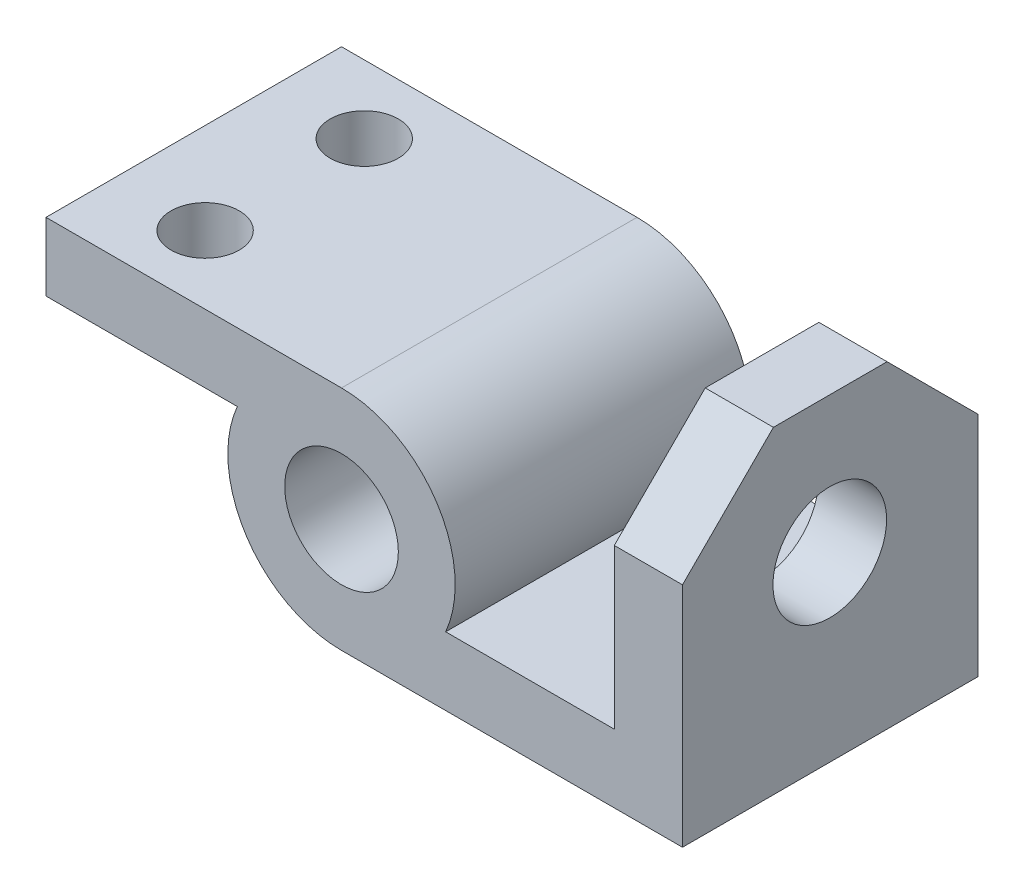
ISO-10303-21;
HEADER;
FILE_DESCRIPTION(('STEP AP214'),'2;1');
FILE_NAME('part.step','',(''),(''),'','','');
FILE_SCHEMA(('AUTOMOTIVE_DESIGN { 1 0 10303 214 1 1 1 1 }'));
ENDSEC;
DATA;
#1=APPLICATION_CONTEXT('core data for automotive mechanical design processes');
#2=APPLICATION_PROTOCOL_DEFINITION('international standard','automotive_design',2000,#1);
#3=PRODUCT_CONTEXT('',#1,'mechanical');
#4=PRODUCT('Part','Part','',(#3));
#5=PRODUCT_RELATED_PRODUCT_CATEGORY('part','',(#4));
#6=PRODUCT_DEFINITION_FORMATION('','',#4);
#7=PRODUCT_DEFINITION_CONTEXT('part definition',#1,'design');
#8=PRODUCT_DEFINITION('design','',#6,#7);
#9=PRODUCT_DEFINITION_SHAPE('','',#8);
#10=(LENGTH_UNIT() NAMED_UNIT(*) SI_UNIT(.MILLI.,.METRE.));
#11=(NAMED_UNIT(*) PLANE_ANGLE_UNIT() SI_UNIT($,.RADIAN.));
#12=(NAMED_UNIT(*) SI_UNIT($,.STERADIAN.) SOLID_ANGLE_UNIT());
#13=UNCERTAINTY_MEASURE_WITH_UNIT(LENGTH_MEASURE(1.E-05),#10,'distance_accuracy_value','');
#14=(GEOMETRIC_REPRESENTATION_CONTEXT(3) GLOBAL_UNCERTAINTY_ASSIGNED_CONTEXT((#13)) GLOBAL_UNIT_ASSIGNED_CONTEXT((#10,
#11,#12)) REPRESENTATION_CONTEXT('',''));
#15=CARTESIAN_POINT('',(0.,0.,0.));
#16=DIRECTION('',(0.,0.,1.));
#17=DIRECTION('',(1.,0.,0.));
#18=AXIS2_PLACEMENT_3D('',#15,#16,#17);
#19=CARTESIAN_POINT('',(0.,0.,3250.));
#20=DIRECTION('',(0.,0.,-1.));
#21=DIRECTION('',(-1.,0.,0.));
#22=AXIS2_PLACEMENT_3D('',#19,#20,#21);
#23=CYLINDRICAL_SURFACE('',#22,1250.);
#24=CARTESIAN_POINT('',(0.,0.,0.));
#25=DIRECTION('',(0.,0.,1.));
#26=DIRECTION('',(1.,0.,0.));
#27=AXIS2_PLACEMENT_3D('',#24,#25,#26);
#28=CIRCLE('',#27,1250.);
#29=CARTESIAN_POINT('',(1145.64392373896,-500.,0.));
#30=VERTEX_POINT('',#29);
#31=CARTESIAN_POINT('',(0.,1250.,0.));
#32=VERTEX_POINT('',#31);
#33=EDGE_CURVE('E164',#30,#32,#28,.T.);
#34=ORIENTED_EDGE('',*,*,#33,.T.);
#35=DIRECTION('',(0.,0.,-1.));
#36=VECTOR('',#35,1.);
#37=CARTESIAN_POINT('',(0.,1250.,3250.));
#38=LINE('',#37,#36);
#39=CARTESIAN_POINT('',(0.,1250.,3250.));
#40=VERTEX_POINT('',#39);
#41=EDGE_CURVE('E142',#40,#32,#38,.T.);
#42=ORIENTED_EDGE('',*,*,#41,.F.);
#43=CARTESIAN_POINT('',(0.,0.,3250.));
#44=DIRECTION('',(0.,0.,1.));
#45=DIRECTION('',(1.,0.,0.));
#46=AXIS2_PLACEMENT_3D('',#43,#44,#45);
#47=CIRCLE('',#46,1250.);
#48=CARTESIAN_POINT('',(1145.64392373896,-500.,3250.));
#49=VERTEX_POINT('',#48);
#50=EDGE_CURVE('E150',#49,#40,#47,.T.);
#51=ORIENTED_EDGE('',*,*,#50,.F.);
#52=DIRECTION('',(0.,0.,-1.));
#53=VECTOR('',#52,1.);
#54=CARTESIAN_POINT('',(1145.64392373896,-500.,3250.));
#55=LINE('',#54,#53);
#56=EDGE_CURVE('E225',#49,#30,#55,.T.);
#57=ORIENTED_EDGE('',*,*,#56,.T.);
#58=EDGE_LOOP('',(#34,#42,#51,#57));
#59=FACE_BOUND('',#58,.T.);
#60=ADVANCED_FACE('F46',(#59),#23,.T.);
#61=CARTESIAN_POINT('',(0.,1250.,3250.));
#62=DIRECTION('',(0.,-1.,0.));
#63=DIRECTION('',(1.,0.,0.));
#64=AXIS2_PLACEMENT_3D('',#61,#62,#63);
#65=PLANE('',#64);
#66=CARTESIAN_POINT('',(-2249.99999999998,1250.,2500.));
#67=DIRECTION('',(0.,1.,0.));
#68=DIRECTION('',(-1.,0.,0.));
#69=AXIS2_PLACEMENT_3D('',#66,#67,#68);
#70=CIRCLE('',#69,375.);
#71=CARTESIAN_POINT('',(-2624.99999999998,1250.,2500.));
#72=VERTEX_POINT('',#71);
#73=EDGE_CURVE('E370',#72,#72,#70,.T.);
#74=ORIENTED_EDGE('',*,*,#73,.F.);
#75=EDGE_LOOP('',(#74));
#76=FACE_BOUND('',#75,.T.);
#77=CARTESIAN_POINT('',(-2250.,1250.,750.));
#78=DIRECTION('',(0.,1.,0.));
#79=DIRECTION('',(-1.,0.,0.));
#80=AXIS2_PLACEMENT_3D('',#77,#78,#79);
#81=CIRCLE('',#80,375.);
#82=CARTESIAN_POINT('',(-2625.,1250.,750.));
#83=VERTEX_POINT('',#82);
#84=EDGE_CURVE('E366',#83,#83,#81,.T.);
#85=ORIENTED_EDGE('',*,*,#84,.F.);
#86=EDGE_LOOP('',(#85));
#87=FACE_BOUND('',#86,.T.);
#88=DIRECTION('',(-1.,0.,0.));
#89=VECTOR('',#88,1.);
#90=CARTESIAN_POINT('',(0.,1250.,0.));
#91=LINE('',#90,#89);
#92=CARTESIAN_POINT('',(-3250.,1250.,0.));
#93=VERTEX_POINT('',#92);
#94=EDGE_CURVE('E261',#32,#93,#91,.T.);
#95=ORIENTED_EDGE('',*,*,#94,.T.);
#96=DIRECTION('',(0.,0.,-1.));
#97=VECTOR('',#96,1.);
#98=CARTESIAN_POINT('',(-3250.,1250.,3250.));
#99=LINE('',#98,#97);
#100=CARTESIAN_POINT('',(-3250.,1250.,3250.));
#101=VERTEX_POINT('',#100);
#102=EDGE_CURVE('E145',#101,#93,#99,.T.);
#103=ORIENTED_EDGE('',*,*,#102,.F.);
#104=DIRECTION('',(-1.,0.,0.));
#105=VECTOR('',#104,1.);
#106=CARTESIAN_POINT('',(0.,1250.,3250.));
#107=LINE('',#106,#105);
#108=EDGE_CURVE('E138',#40,#101,#107,.T.);
#109=ORIENTED_EDGE('',*,*,#108,.F.);
#110=ORIENTED_EDGE('',*,*,#41,.T.);
#111=EDGE_LOOP('',(#95,#103,#109,#110));
#112=FACE_BOUND('',#111,.T.);
#113=ADVANCED_FACE('F140',(#76,#87,#112),#65,.F.);
#114=CARTESIAN_POINT('',(-3250.,1250.,3250.));
#115=DIRECTION('',(1.,0.,0.));
#116=DIRECTION('',(0.,0.,-1.));
#117=AXIS2_PLACEMENT_3D('',#114,#115,#116);
#118=PLANE('',#117);
#119=DIRECTION('',(0.,-1.,0.));
#120=VECTOR('',#119,1.);
#121=CARTESIAN_POINT('',(-3250.,1250.,0.));
#122=LINE('',#121,#120);
#123=CARTESIAN_POINT('',(-3250.,500.,0.));
#124=VERTEX_POINT('',#123);
#125=EDGE_CURVE('E252',#93,#124,#122,.T.);
#126=ORIENTED_EDGE('',*,*,#125,.T.);
#127=DIRECTION('',(0.,0.,-1.));
#128=VECTOR('',#127,1.);
#129=CARTESIAN_POINT('',(-3250.,500.,3250.));
#130=LINE('',#129,#128);
#131=CARTESIAN_POINT('',(-3250.,500.,3250.));
#132=VERTEX_POINT('',#131);
#133=EDGE_CURVE('E173',#132,#124,#130,.T.);
#134=ORIENTED_EDGE('',*,*,#133,.F.);
#135=DIRECTION('',(0.,-1.,0.));
#136=VECTOR('',#135,1.);
#137=CARTESIAN_POINT('',(-3250.,1250.,3250.));
#138=LINE('',#137,#136);
#139=EDGE_CURVE('E149',#101,#132,#138,.T.);
#140=ORIENTED_EDGE('',*,*,#139,.F.);
#141=ORIENTED_EDGE('',*,*,#102,.T.);
#142=EDGE_LOOP('',(#126,#134,#140,#141));
#143=FACE_BOUND('',#142,.T.);
#144=ADVANCED_FACE('F283',(#143),#118,.F.);
#145=CARTESIAN_POINT('',(-3250.,500.,3250.));
#146=DIRECTION('',(0.,1.,0.));
#147=DIRECTION('',(0.,0.,1.));
#148=AXIS2_PLACEMENT_3D('',#145,#146,#147);
#149=PLANE('',#148);
#150=CARTESIAN_POINT('',(-2249.99999999998,500.,2500.));
#151=DIRECTION('',(0.,1.,0.));
#152=DIRECTION('',(0.,0.,1.));
#153=AXIS2_PLACEMENT_3D('',#150,#151,#152);
#154=CIRCLE('',#153,375.);
#155=CARTESIAN_POINT('',(-2249.99999999998,500.,2875.));
#156=VERTEX_POINT('',#155);
#157=EDGE_CURVE('E363',#156,#156,#154,.F.);
#158=ORIENTED_EDGE('',*,*,#157,.F.);
#159=EDGE_LOOP('',(#158));
#160=FACE_BOUND('',#159,.T.);
#161=CARTESIAN_POINT('',(-2250.,500.,750.));
#162=DIRECTION('',(0.,1.,0.));
#163=DIRECTION('',(0.,0.,1.));
#164=AXIS2_PLACEMENT_3D('',#161,#162,#163);
#165=CIRCLE('',#164,375.);
#166=CARTESIAN_POINT('',(-2250.,500.,1125.));
#167=VERTEX_POINT('',#166);
#168=EDGE_CURVE('E371',#167,#167,#165,.F.);
#169=ORIENTED_EDGE('',*,*,#168,.F.);
#170=EDGE_LOOP('',(#169));
#171=FACE_BOUND('',#170,.T.);
#172=DIRECTION('',(1.,0.,0.));
#173=VECTOR('',#172,1.);
#174=CARTESIAN_POINT('',(-3250.,500.,0.));
#175=LINE('',#174,#173);
#176=CARTESIAN_POINT('',(-1145.64392373896,500.,0.));
#177=VERTEX_POINT('',#176);
#178=EDGE_CURVE('E246',#124,#177,#175,.T.);
#179=ORIENTED_EDGE('',*,*,#178,.T.);
#180=DIRECTION('',(0.,0.,-1.));
#181=VECTOR('',#180,1.);
#182=CARTESIAN_POINT('',(-1145.64392373896,500.,3250.));
#183=LINE('',#182,#181);
#184=CARTESIAN_POINT('',(-1145.64392373896,500.,3250.));
#185=VERTEX_POINT('',#184);
#186=EDGE_CURVE('E235',#185,#177,#183,.T.);
#187=ORIENTED_EDGE('',*,*,#186,.F.);
#188=DIRECTION('',(1.,0.,0.));
#189=VECTOR('',#188,1.);
#190=CARTESIAN_POINT('',(-3250.,500.,3250.));
#191=LINE('',#190,#189);
#192=EDGE_CURVE('E247',#132,#185,#191,.T.);
#193=ORIENTED_EDGE('',*,*,#192,.F.);
#194=ORIENTED_EDGE('',*,*,#133,.T.);
#195=EDGE_LOOP('',(#179,#187,#193,#194));
#196=FACE_BOUND('',#195,.T.);
#197=ADVANCED_FACE('F244',(#160,#171,#196),#149,.F.);
#198=CARTESIAN_POINT('',(0.,0.,3250.));
#199=DIRECTION('',(0.,0.,-1.));
#200=DIRECTION('',(-1.,0.,0.));
#201=AXIS2_PLACEMENT_3D('',#198,#199,#200);
#202=CYLINDRICAL_SURFACE('',#201,1250.);
#203=CARTESIAN_POINT('',(0.,0.,0.));
#204=DIRECTION('',(0.,0.,1.));
#205=DIRECTION('',(1.,0.,0.));
#206=AXIS2_PLACEMENT_3D('',#203,#204,#205);
#207=CIRCLE('',#206,1250.);
#208=CARTESIAN_POINT('',(-2.29621274840129E-13,-1250.,0.));
#209=VERTEX_POINT('',#208);
#210=EDGE_CURVE('E254',#177,#209,#207,.T.);
#211=ORIENTED_EDGE('',*,*,#210,.T.);
#212=DIRECTION('',(0.,0.,-1.));
#213=VECTOR('',#212,1.);
#214=CARTESIAN_POINT('',(-2.29621274840129E-13,-1250.,3250.));
#215=LINE('',#214,#213);
#216=CARTESIAN_POINT('',(-2.29621274840129E-13,-1250.,3250.));
#217=VERTEX_POINT('',#216);
#218=EDGE_CURVE('E231',#217,#209,#215,.T.);
#219=ORIENTED_EDGE('',*,*,#218,.F.);
#220=CARTESIAN_POINT('',(0.,0.,3250.));
#221=DIRECTION('',(0.,0.,1.));
#222=DIRECTION('',(1.,0.,0.));
#223=AXIS2_PLACEMENT_3D('',#220,#221,#222);
#224=CIRCLE('',#223,1250.);
#225=EDGE_CURVE('E287',#185,#217,#224,.T.);
#226=ORIENTED_EDGE('',*,*,#225,.F.);
#227=ORIENTED_EDGE('',*,*,#186,.T.);
#228=EDGE_LOOP('',(#211,#219,#226,#227));
#229=FACE_BOUND('',#228,.T.);
#230=ADVANCED_FACE('F296',(#229),#202,.T.);
#231=CARTESIAN_POINT('',(0.,-1250.,3250.));
#232=DIRECTION('',(0.,1.,0.));
#233=DIRECTION('',(0.,0.,1.));
#234=AXIS2_PLACEMENT_3D('',#231,#232,#233);
#235=PLANE('',#234);
#236=DIRECTION('',(1.,0.,0.));
#237=VECTOR('',#236,1.);
#238=CARTESIAN_POINT('',(0.,-1250.,0.));
#239=LINE('',#238,#237);
#240=CARTESIAN_POINT('',(3750.,-1250.,0.));
#241=VERTEX_POINT('',#240);
#242=EDGE_CURVE('E259',#209,#241,#239,.T.);
#243=ORIENTED_EDGE('',*,*,#242,.T.);
#244=DIRECTION('',(0.,0.,-1.));
#245=VECTOR('',#244,1.);
#246=CARTESIAN_POINT('',(3750.,-1250.,3250.));
#247=LINE('',#246,#245);
#248=CARTESIAN_POINT('',(3750.,-1250.,3250.));
#249=VERTEX_POINT('',#248);
#250=EDGE_CURVE('E222',#249,#241,#247,.T.);
#251=ORIENTED_EDGE('',*,*,#250,.F.);
#252=DIRECTION('',(1.,0.,0.));
#253=VECTOR('',#252,1.);
#254=CARTESIAN_POINT('',(0.,-1250.,3250.));
#255=LINE('',#254,#253);
#256=EDGE_CURVE('E202',#217,#249,#255,.T.);
#257=ORIENTED_EDGE('',*,*,#256,.F.);
#258=ORIENTED_EDGE('',*,*,#218,.T.);
#259=EDGE_LOOP('',(#243,#251,#257,#258));
#260=FACE_BOUND('',#259,.T.);
#261=ADVANCED_FACE('F298',(#260),#235,.F.);
#262=CARTESIAN_POINT('',(3750.,-1250.,3250.));
#263=DIRECTION('',(-1.,0.,0.));
#264=DIRECTION('',(0.,0.,1.));
#265=AXIS2_PLACEMENT_3D('',#262,#263,#264);
#266=PLANE('',#265);
#267=CARTESIAN_POINT('',(3750.,750.,1630.));
#268=DIRECTION('',(1.,0.,0.));
#269=DIRECTION('',(0.,0.,-1.));
#270=AXIS2_PLACEMENT_3D('',#267,#268,#269);
#271=CIRCLE('',#270,625.);
#272=CARTESIAN_POINT('',(3750.,750.,1005.));
#273=VERTEX_POINT('',#272);
#274=EDGE_CURVE('E382',#273,#273,#271,.T.);
#275=ORIENTED_EDGE('',*,*,#274,.F.);
#276=EDGE_LOOP('',(#275));
#277=FACE_BOUND('',#276,.T.);
#278=DIRECTION('',(0.,0.,-1.));
#279=VECTOR('',#278,1.);
#280=CARTESIAN_POINT('',(3750.,2250.,3250.));
#281=LINE('',#280,#279);
#282=CARTESIAN_POINT('',(3750.,2250.,2250.));
#283=VERTEX_POINT('',#282);
#284=CARTESIAN_POINT('',(3750.,2250.,1000.));
#285=VERTEX_POINT('',#284);
#286=EDGE_CURVE('E196',#283,#285,#281,.T.);
#287=ORIENTED_EDGE('',*,*,#286,.F.);
#288=DIRECTION('',(0.,-0.707106781186548,0.707106781186548));
#289=VECTOR('',#288,1.);
#290=CARTESIAN_POINT('',(3750.,1250.,3250.));
#291=LINE('',#290,#289);
#292=CARTESIAN_POINT('',(3750.,1250.,3250.));
#293=VERTEX_POINT('',#292);
#294=EDGE_CURVE('E56',#283,#293,#291,.T.);
#295=ORIENTED_EDGE('',*,*,#294,.T.);
#296=DIRECTION('',(0.,1.,0.));
#297=VECTOR('',#296,1.);
#298=CARTESIAN_POINT('',(3750.,-1250.,3250.));
#299=LINE('',#298,#297);
#300=EDGE_CURVE('E195',#249,#293,#299,.T.);
#301=ORIENTED_EDGE('',*,*,#300,.F.);
#302=ORIENTED_EDGE('',*,*,#250,.T.);
#303=DIRECTION('',(0.,1.,0.));
#304=VECTOR('',#303,1.);
#305=CARTESIAN_POINT('',(3750.,-1250.,0.));
#306=LINE('',#305,#304);
#307=CARTESIAN_POINT('',(3750.,1250.,0.));
#308=VERTEX_POINT('',#307);
#309=EDGE_CURVE('E267',#241,#308,#306,.T.);
#310=ORIENTED_EDGE('',*,*,#309,.T.);
#311=DIRECTION('',(0.,-0.707106781186547,-0.707106781186548));
#312=VECTOR('',#311,1.);
#313=CARTESIAN_POINT('',(3750.,2250.,1000.));
#314=LINE('',#313,#312);
#315=EDGE_CURVE('E68',#308,#285,#314,.F.);
#316=ORIENTED_EDGE('',*,*,#315,.T.);
#317=EDGE_LOOP('',(#287,#295,#301,#302,#310,#316));
#318=FACE_BOUND('',#317,.T.);
#319=ADVANCED_FACE('F193',(#277,#318),#266,.F.);
#320=CARTESIAN_POINT('',(3750.,2250.,3250.));
#321=DIRECTION('',(0.,-1.,0.));
#322=DIRECTION('',(0.,0.,-1.));
#323=AXIS2_PLACEMENT_3D('',#320,#321,#322);
#324=PLANE('',#323);
#325=DIRECTION('',(0.,0.,-1.));
#326=VECTOR('',#325,1.);
#327=CARTESIAN_POINT('',(3000.,2250.,3250.));
#328=LINE('',#327,#326);
#329=CARTESIAN_POINT('',(3000.,2250.,2250.));
#330=VERTEX_POINT('',#329);
#331=CARTESIAN_POINT('',(3000.,2250.,1000.));
#332=VERTEX_POINT('',#331);
#333=EDGE_CURVE('E212',#330,#332,#328,.T.);
#334=ORIENTED_EDGE('',*,*,#333,.F.);
#335=DIRECTION('',(1.,0.,0.));
#336=VECTOR('',#335,1.);
#337=CARTESIAN_POINT('',(3750.,2250.,2250.));
#338=LINE('',#337,#336);
#339=EDGE_CURVE('E186',#330,#283,#338,.T.);
#340=ORIENTED_EDGE('',*,*,#339,.T.);
#341=ORIENTED_EDGE('',*,*,#286,.T.);
#342=DIRECTION('',(-1.,0.,0.));
#343=VECTOR('',#342,1.);
#344=CARTESIAN_POINT('',(3750.,2250.,1000.));
#345=LINE('',#344,#343);
#346=EDGE_CURVE('E182',#285,#332,#345,.T.);
#347=ORIENTED_EDGE('',*,*,#346,.T.);
#348=EDGE_LOOP('',(#334,#340,#341,#347));
#349=FACE_BOUND('',#348,.T.);
#350=ADVANCED_FACE('F215',(#349),#324,.F.);
#351=CARTESIAN_POINT('',(3000.,2250.,3250.));
#352=DIRECTION('',(1.,0.,0.));
#353=DIRECTION('',(0.,1.,0.));
#354=AXIS2_PLACEMENT_3D('',#351,#352,#353);
#355=PLANE('',#354);
#356=CARTESIAN_POINT('',(3000.,750.,1630.));
#357=DIRECTION('',(1.,0.,0.));
#358=DIRECTION('',(0.,1.,0.));
#359=AXIS2_PLACEMENT_3D('',#356,#357,#358);
#360=CIRCLE('',#359,625.);
#361=CARTESIAN_POINT('',(3000.,750.,1005.));
#362=VERTEX_POINT('',#361);
#363=EDGE_CURVE('E375',#362,#362,#360,.F.);
#364=ORIENTED_EDGE('',*,*,#363,.F.);
#365=EDGE_LOOP('',(#364));
#366=FACE_BOUND('',#365,.T.);
#367=DIRECTION('',(0.,-1.,0.));
#368=VECTOR('',#367,1.);
#369=CARTESIAN_POINT('',(3000.,2250.,3250.));
#370=LINE('',#369,#368);
#371=CARTESIAN_POINT('',(3000.,1250.,3250.));
#372=VERTEX_POINT('',#371);
#373=CARTESIAN_POINT('',(3000.,-500.,3250.));
#374=VERTEX_POINT('',#373);
#375=EDGE_CURVE('E205',#372,#374,#370,.T.);
#376=ORIENTED_EDGE('',*,*,#375,.F.);
#377=DIRECTION('',(0.,0.707106781186548,-0.707106781186548));
#378=VECTOR('',#377,1.);
#379=CARTESIAN_POINT('',(3000.,1250.,3250.));
#380=LINE('',#379,#378);
#381=EDGE_CURVE('E179',#372,#330,#380,.T.);
#382=ORIENTED_EDGE('',*,*,#381,.T.);
#383=ORIENTED_EDGE('',*,*,#333,.T.);
#384=DIRECTION('',(0.,0.707106781186547,0.707106781186548));
#385=VECTOR('',#384,1.);
#386=CARTESIAN_POINT('',(3000.,2250.,1000.));
#387=LINE('',#386,#385);
#388=CARTESIAN_POINT('',(3000.,1250.,0.));
#389=VERTEX_POINT('',#388);
#390=EDGE_CURVE('E171',#332,#389,#387,.F.);
#391=ORIENTED_EDGE('',*,*,#390,.T.);
#392=DIRECTION('',(0.,-1.,0.));
#393=VECTOR('',#392,1.);
#394=CARTESIAN_POINT('',(3000.,2250.,0.));
#395=LINE('',#394,#393);
#396=CARTESIAN_POINT('',(3000.,-500.,0.));
#397=VERTEX_POINT('',#396);
#398=EDGE_CURVE('E270',#389,#397,#395,.T.);
#399=ORIENTED_EDGE('',*,*,#398,.T.);
#400=DIRECTION('',(0.,0.,-1.));
#401=VECTOR('',#400,1.);
#402=CARTESIAN_POINT('',(3000.,-500.,3250.));
#403=LINE('',#402,#401);
#404=EDGE_CURVE('E218',#374,#397,#403,.T.);
#405=ORIENTED_EDGE('',*,*,#404,.F.);
#406=EDGE_LOOP('',(#376,#382,#383,#391,#399,#405));
#407=FACE_BOUND('',#406,.T.);
#408=ADVANCED_FACE('F211',(#366,#407),#355,.F.);
#409=CARTESIAN_POINT('',(3000.,-500.,3250.));
#410=DIRECTION('',(0.,-1.,0.));
#411=DIRECTION('',(1.,0.,0.));
#412=AXIS2_PLACEMENT_3D('',#409,#410,#411);
#413=PLANE('',#412);
#414=DIRECTION('',(-1.,0.,0.));
#415=VECTOR('',#414,1.);
#416=CARTESIAN_POINT('',(3000.,-500.,0.));
#417=LINE('',#416,#415);
#418=EDGE_CURVE('E161',#397,#30,#417,.T.);
#419=ORIENTED_EDGE('',*,*,#418,.T.);
#420=ORIENTED_EDGE('',*,*,#56,.F.);
#421=DIRECTION('',(-1.,0.,0.));
#422=VECTOR('',#421,1.);
#423=CARTESIAN_POINT('',(3000.,-500.,3250.));
#424=LINE('',#423,#422);
#425=EDGE_CURVE('E156',#374,#49,#424,.T.);
#426=ORIENTED_EDGE('',*,*,#425,.F.);
#427=ORIENTED_EDGE('',*,*,#404,.T.);
#428=EDGE_LOOP('',(#419,#420,#426,#427));
#429=FACE_BOUND('',#428,.T.);
#430=ADVANCED_FACE('F302',(#429),#413,.F.);
#431=CARTESIAN_POINT('',(0.,0.,3250.));
#432=DIRECTION('',(0.,0.,1.));
#433=DIRECTION('',(1.,0.,0.));
#434=AXIS2_PLACEMENT_3D('',#431,#432,#433);
#435=PLANE('',#434);
#436=CARTESIAN_POINT('',(0.,0.,3250.));
#437=DIRECTION('',(0.,0.,1.));
#438=DIRECTION('',(1.,0.,0.));
#439=AXIS2_PLACEMENT_3D('',#436,#437,#438);
#440=CIRCLE('',#439,625.);
#441=CARTESIAN_POINT('',(625.,0.,3250.));
#442=VERTEX_POINT('',#441);
#443=EDGE_CURVE('E359',#442,#442,#440,.T.);
#444=ORIENTED_EDGE('',*,*,#443,.F.);
#445=EDGE_LOOP('',(#444));
#446=FACE_BOUND('',#445,.T.);
#447=ORIENTED_EDGE('',*,*,#300,.T.);
#448=DIRECTION('',(-1.,0.,0.));
#449=VECTOR('',#448,1.);
#450=CARTESIAN_POINT('',(3000.,1250.,3250.));
#451=LINE('',#450,#449);
#452=EDGE_CURVE('E166',#293,#372,#451,.T.);
#453=ORIENTED_EDGE('',*,*,#452,.T.);
#454=ORIENTED_EDGE('',*,*,#375,.T.);
#455=ORIENTED_EDGE('',*,*,#425,.T.);
#456=ORIENTED_EDGE('',*,*,#50,.T.);
#457=ORIENTED_EDGE('',*,*,#108,.T.);
#458=ORIENTED_EDGE('',*,*,#139,.T.);
#459=ORIENTED_EDGE('',*,*,#192,.T.);
#460=ORIENTED_EDGE('',*,*,#225,.T.);
#461=ORIENTED_EDGE('',*,*,#256,.T.);
#462=EDGE_LOOP('',(#447,#453,#454,#455,#456,#457,#458,#459,#460,#461));
#463=FACE_BOUND('',#462,.T.);
#464=ADVANCED_FACE('F154',(#446,#463),#435,.T.);
#465=CARTESIAN_POINT('',(0.,0.,0.));
#466=DIRECTION('',(0.,0.,1.));
#467=DIRECTION('',(1.,0.,0.));
#468=AXIS2_PLACEMENT_3D('',#465,#466,#467);
#469=PLANE('',#468);
#470=CARTESIAN_POINT('',(0.,0.,0.));
#471=DIRECTION('',(0.,0.,1.));
#472=DIRECTION('',(1.,0.,0.));
#473=AXIS2_PLACEMENT_3D('',#470,#471,#472);
#474=CIRCLE('',#473,625.);
#475=CARTESIAN_POINT('',(625.,0.,0.));
#476=VERTEX_POINT('',#475);
#477=EDGE_CURVE('E281',#476,#476,#474,.T.);
#478=ORIENTED_EDGE('',*,*,#477,.T.);
#479=EDGE_LOOP('',(#478));
#480=FACE_BOUND('',#479,.T.);
#481=ORIENTED_EDGE('',*,*,#398,.F.);
#482=DIRECTION('',(1.,0.,0.));
#483=VECTOR('',#482,1.);
#484=CARTESIAN_POINT('',(0.,1250.,0.));
#485=LINE('',#484,#483);
#486=EDGE_CURVE('E12',#389,#308,#485,.T.);
#487=ORIENTED_EDGE('',*,*,#486,.T.);
#488=ORIENTED_EDGE('',*,*,#309,.F.);
#489=ORIENTED_EDGE('',*,*,#242,.F.);
#490=ORIENTED_EDGE('',*,*,#210,.F.);
#491=ORIENTED_EDGE('',*,*,#178,.F.);
#492=ORIENTED_EDGE('',*,*,#125,.F.);
#493=ORIENTED_EDGE('',*,*,#94,.F.);
#494=ORIENTED_EDGE('',*,*,#33,.F.);
#495=ORIENTED_EDGE('',*,*,#418,.F.);
#496=EDGE_LOOP('',(#481,#487,#488,#489,#490,#491,#492,#493,#494,#495));
#497=FACE_BOUND('',#496,.T.);
#498=ADVANCED_FACE('F251',(#480,#497),#469,.F.);
#499=CARTESIAN_POINT('',(0.,0.,0.));
#500=DIRECTION('',(0.,0.,1.));
#501=DIRECTION('',(1.,0.,0.));
#502=AXIS2_PLACEMENT_3D('',#499,#500,#501);
#503=CYLINDRICAL_SURFACE('',#502,625.);
#504=ORIENTED_EDGE('',*,*,#477,.F.);
#505=EDGE_LOOP('',(#504));
#506=FACE_BOUND('',#505,.T.);
#507=ORIENTED_EDGE('',*,*,#443,.T.);
#508=EDGE_LOOP('',(#507));
#509=FACE_BOUND('',#508,.T.);
#510=ADVANCED_FACE('F348',(#506,#509),#503,.F.);
#511=CARTESIAN_POINT('',(-2250.,-1250.001,750.));
#512=DIRECTION('',(0.,1.,0.));
#513=DIRECTION('',(-1.,0.,0.));
#514=AXIS2_PLACEMENT_3D('',#511,#512,#513);
#515=CYLINDRICAL_SURFACE('',#514,375.);
#516=ORIENTED_EDGE('',*,*,#84,.T.);
#517=EDGE_LOOP('',(#516));
#518=FACE_BOUND('',#517,.T.);
#519=ORIENTED_EDGE('',*,*,#168,.T.);
#520=EDGE_LOOP('',(#519));
#521=FACE_BOUND('',#520,.T.);
#522=ADVANCED_FACE('F340',(#518,#521),#515,.F.);
#523=CARTESIAN_POINT('',(-2249.99999999998,-1250.001,2500.));
#524=DIRECTION('',(0.,1.,0.));
#525=DIRECTION('',(-1.,0.,0.));
#526=AXIS2_PLACEMENT_3D('',#523,#524,#525);
#527=CYLINDRICAL_SURFACE('',#526,375.);
#528=ORIENTED_EDGE('',*,*,#73,.T.);
#529=EDGE_LOOP('',(#528));
#530=FACE_BOUND('',#529,.T.);
#531=ORIENTED_EDGE('',*,*,#157,.T.);
#532=EDGE_LOOP('',(#531));
#533=FACE_BOUND('',#532,.T.);
#534=ADVANCED_FACE('F334',(#530,#533),#527,.F.);
#535=CARTESIAN_POINT('',(-3250.001,750.,1630.));
#536=DIRECTION('',(1.,0.,0.));
#537=DIRECTION('',(0.,0.,-1.));
#538=AXIS2_PLACEMENT_3D('',#535,#536,#537);
#539=CYLINDRICAL_SURFACE('',#538,625.);
#540=CARTESIAN_POINT('',(3750.,750.,1005.));
#541=CARTESIAN_POINT('',(3742.1875,750.,1005.));
#542=CARTESIAN_POINT('',(3734.375,750.,1005.));
#543=CARTESIAN_POINT('',(3718.75,750.,1005.));
#544=CARTESIAN_POINT('',(3710.9375,750.,1005.));
#545=CARTESIAN_POINT('',(3695.3125,750.,1005.));
#546=CARTESIAN_POINT('',(3687.5,750.,1005.));
#547=CARTESIAN_POINT('',(3671.875,750.,1005.));
#548=CARTESIAN_POINT('',(3664.0625,750.,1005.));
#549=CARTESIAN_POINT('',(3648.4375,750.,1005.));
#550=CARTESIAN_POINT('',(3640.625,750.,1005.));
#551=CARTESIAN_POINT('',(3625.,750.,1005.));
#552=CARTESIAN_POINT('',(3617.1875,750.,1005.));
#553=CARTESIAN_POINT('',(3601.5625,750.,1005.));
#554=CARTESIAN_POINT('',(3593.75,750.,1005.));
#555=CARTESIAN_POINT('',(3578.125,750.,1005.));
#556=CARTESIAN_POINT('',(3570.3125,750.,1005.));
#557=CARTESIAN_POINT('',(3554.6875,750.,1005.));
#558=CARTESIAN_POINT('',(3546.875,750.,1005.));
#559=CARTESIAN_POINT('',(3531.25,750.,1005.));
#560=CARTESIAN_POINT('',(3523.4375,750.,1005.));
#561=CARTESIAN_POINT('',(3507.8125,750.,1005.));
#562=CARTESIAN_POINT('',(3500.,750.,1005.));
#563=CARTESIAN_POINT('',(3484.375,750.,1005.));
#564=CARTESIAN_POINT('',(3476.5625,750.,1005.));
#565=CARTESIAN_POINT('',(3460.9375,750.,1005.));
#566=CARTESIAN_POINT('',(3453.125,750.,1005.));
#567=CARTESIAN_POINT('',(3437.5,750.,1005.));
#568=CARTESIAN_POINT('',(3429.6875,750.,1005.));
#569=CARTESIAN_POINT('',(3414.0625,750.,1005.));
#570=CARTESIAN_POINT('',(3406.25,750.,1005.));
#571=CARTESIAN_POINT('',(3390.625,750.,1005.));
#572=CARTESIAN_POINT('',(3382.8125,750.,1005.));
#573=CARTESIAN_POINT('',(3367.1875,750.,1005.));
#574=CARTESIAN_POINT('',(3359.375,750.,1005.));
#575=CARTESIAN_POINT('',(3343.75,750.,1005.));
#576=CARTESIAN_POINT('',(3335.9375,750.,1005.));
#577=CARTESIAN_POINT('',(3320.3125,750.,1005.));
#578=CARTESIAN_POINT('',(3312.5,750.,1005.));
#579=CARTESIAN_POINT('',(3296.875,750.,1005.));
#580=CARTESIAN_POINT('',(3289.0625,750.,1005.));
#581=CARTESIAN_POINT('',(3273.4375,750.,1005.));
#582=CARTESIAN_POINT('',(3265.625,750.,1005.));
#583=CARTESIAN_POINT('',(3250.,750.,1005.));
#584=CARTESIAN_POINT('',(3242.1875,750.,1005.));
#585=CARTESIAN_POINT('',(3226.5625,750.,1005.));
#586=CARTESIAN_POINT('',(3218.75,750.,1005.));
#587=CARTESIAN_POINT('',(3203.125,750.,1005.));
#588=CARTESIAN_POINT('',(3195.3125,750.,1005.));
#589=CARTESIAN_POINT('',(3179.6875,750.,1005.));
#590=CARTESIAN_POINT('',(3171.875,750.,1005.));
#591=CARTESIAN_POINT('',(3156.25,750.,1005.));
#592=CARTESIAN_POINT('',(3148.4375,750.,1005.));
#593=CARTESIAN_POINT('',(3132.8125,750.,1005.));
#594=CARTESIAN_POINT('',(3125.,750.,1005.));
#595=CARTESIAN_POINT('',(3109.375,750.,1005.));
#596=CARTESIAN_POINT('',(3101.5625,750.,1005.));
#597=CARTESIAN_POINT('',(3085.9375,750.,1005.));
#598=CARTESIAN_POINT('',(3078.125,750.,1005.));
#599=CARTESIAN_POINT('',(3062.5,750.,1005.));
#600=CARTESIAN_POINT('',(3054.6875,750.,1005.));
#601=CARTESIAN_POINT('',(3039.0625,750.,1005.));
#602=CARTESIAN_POINT('',(3031.25,750.,1005.));
#603=CARTESIAN_POINT('',(3015.625,750.,1005.));
#604=CARTESIAN_POINT('',(3007.8125,750.,1005.));
#605=CARTESIAN_POINT('',(3000.,750.,1005.));
#606=B_SPLINE_CURVE_WITH_KNOTS('',3,(#540,#541,#542,#543,#544,#545,#546,#547,#548,#549,#550,
#551,#552,#553,#554,#555,#556,#557,#558,#559,#560,#561,#562,#563,#564,#565,#566,#567,#568,#569,
#570,#571,#572,#573,#574,#575,#576,#577,#578,#579,#580,#581,#582,#583,#584,#585,#586,#587,#588,
#589,#590,#591,#592,#593,#594,#595,#596,#597,#598,#599,#600,#601,#602,#603,#604,#605),
.UNSPECIFIED.,.F.,.F.,(4,2,2,2,2,2,2,2,2,2,2,2,2,2,2,2,2,2,2,2,2,2,2,2,2,2,2,2,2,2,2,2,4),(0.,
23.4375,46.875,70.3125,93.75,117.1875,140.625,164.0625,187.5,210.9375,234.375,257.8125,281.25,
304.6875,328.125,351.5625,375.,398.4375,421.875,445.3125,468.75,492.1875,515.625,539.0625,562.5,
585.9375,609.375,632.8125,656.25,679.6875,703.125,726.5625,750.),.UNSPECIFIED.);
#607=EDGE_CURVE('BSEAM329',#273,#362,#606,.T.);
#608=ORIENTED_EDGE('',*,*,#274,.T.);
#609=ORIENTED_EDGE('',*,*,#363,.T.);
#610=ORIENTED_EDGE('',*,*,#607,.T.);
#611=ORIENTED_EDGE('',*,*,#607,.F.);
#612=EDGE_LOOP('',(#608,#610,#609,#611));
#613=FACE_BOUND('',#612,.T.);
#614=ADVANCED_FACE('F329',(#613),#539,.F.);
#615=CARTESIAN_POINT('',(0.,1250.,3250.));
#616=DIRECTION('',(0.,0.707106781186548,0.707106781186548));
#617=DIRECTION('',(1.,0.,0.));
#618=AXIS2_PLACEMENT_3D('',#615,#616,#617);
#619=PLANE('',#618);
#620=ORIENTED_EDGE('',*,*,#294,.F.);
#621=ORIENTED_EDGE('',*,*,#339,.F.);
#622=ORIENTED_EDGE('',*,*,#381,.F.);
#623=ORIENTED_EDGE('',*,*,#452,.F.);
#624=EDGE_LOOP('',(#620,#621,#622,#623));
#625=FACE_BOUND('',#624,.T.);
#626=ADVANCED_FACE('F207',(#625),#619,.T.);
#627=CARTESIAN_POINT('',(3750.,2250.,1000.));
#628=DIRECTION('',(0.,-0.707106781186548,0.707106781186547));
#629=DIRECTION('',(-1.,0.,0.));
#630=AXIS2_PLACEMENT_3D('',#627,#628,#629);
#631=PLANE('',#630);
#632=ORIENTED_EDGE('',*,*,#315,.F.);
#633=ORIENTED_EDGE('',*,*,#486,.F.);
#634=ORIENTED_EDGE('',*,*,#390,.F.);
#635=ORIENTED_EDGE('',*,*,#346,.F.);
#636=EDGE_LOOP('',(#632,#633,#634,#635));
#637=FACE_BOUND('',#636,.T.);
#638=ADVANCED_FACE('F49',(#637),#631,.F.);
#639=CLOSED_SHELL('',(#60,#113,#144,#197,#230,#261,#319,#350,#408,#430,#464,#498,#510,#522,#534,
#614,#626,#638));
#640=MANIFOLD_SOLID_BREP('B2',#639);
#641=ADVANCED_BREP_SHAPE_REPRESENTATION('',(#18,#640),#14);
#642=SHAPE_DEFINITION_REPRESENTATION(#9,#641);
ENDSEC;
END-ISO-10303-21;
